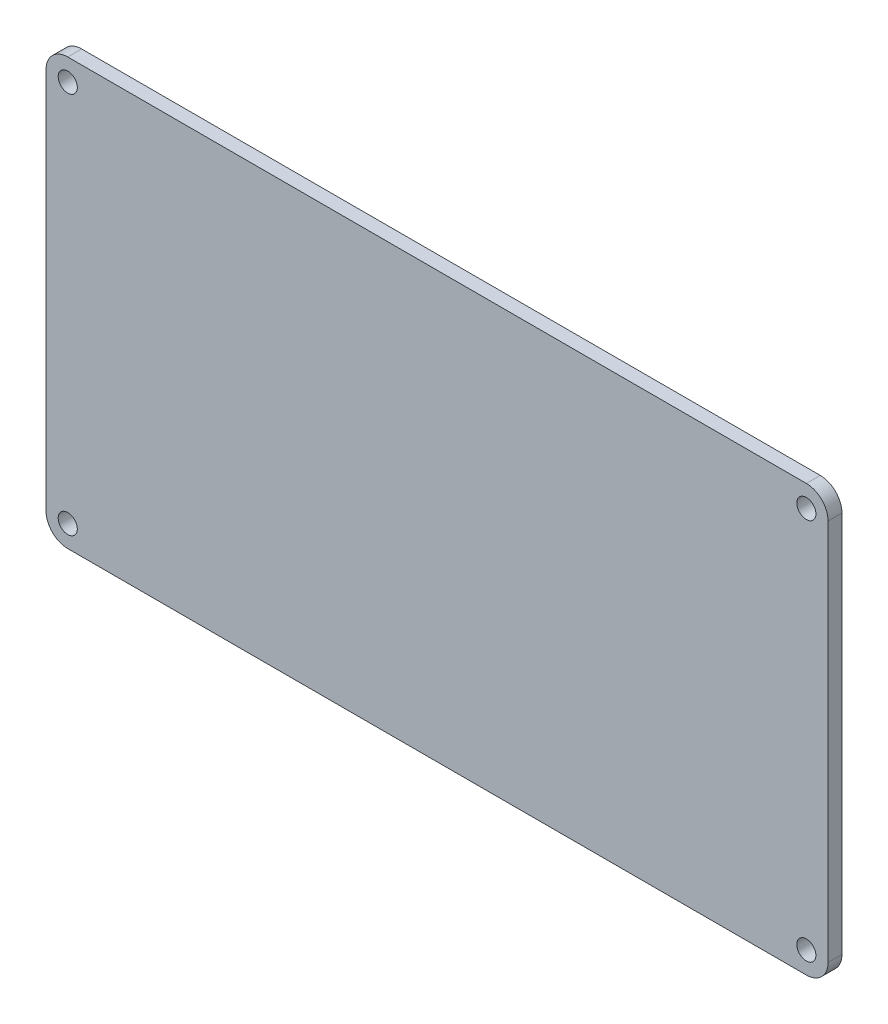
ISO-10303-21;
HEADER;
FILE_DESCRIPTION(('STEP AP214'),'2;1');
FILE_NAME('part.step','',(''),(''),'','','');
FILE_SCHEMA(('AUTOMOTIVE_DESIGN { 1 0 10303 214 1 1 1 1 }'));
ENDSEC;
DATA;
#1=APPLICATION_CONTEXT('core data for automotive mechanical design processes');
#2=APPLICATION_PROTOCOL_DEFINITION('international standard','automotive_design',2000,#1);
#3=PRODUCT_CONTEXT('',#1,'mechanical');
#4=PRODUCT('Part','Part','',(#3));
#5=PRODUCT_RELATED_PRODUCT_CATEGORY('part','',(#4));
#6=PRODUCT_DEFINITION_FORMATION('','',#4);
#7=PRODUCT_DEFINITION_CONTEXT('part definition',#1,'design');
#8=PRODUCT_DEFINITION('design','',#6,#7);
#9=PRODUCT_DEFINITION_SHAPE('','',#8);
#10=(LENGTH_UNIT() NAMED_UNIT(*) SI_UNIT(.MILLI.,.METRE.));
#11=(NAMED_UNIT(*) PLANE_ANGLE_UNIT() SI_UNIT($,.RADIAN.));
#12=(NAMED_UNIT(*) SI_UNIT($,.STERADIAN.) SOLID_ANGLE_UNIT());
#13=UNCERTAINTY_MEASURE_WITH_UNIT(LENGTH_MEASURE(1.E-05),#10,'distance_accuracy_value','');
#14=(GEOMETRIC_REPRESENTATION_CONTEXT(3) GLOBAL_UNCERTAINTY_ASSIGNED_CONTEXT((#13)) GLOBAL_UNIT_ASSIGNED_CONTEXT((#10,
#11,#12)) REPRESENTATION_CONTEXT('',''));
#15=CARTESIAN_POINT('',(0.,0.,0.));
#16=DIRECTION('',(0.,0.,1.));
#17=DIRECTION('',(1.,0.,0.));
#18=AXIS2_PLACEMENT_3D('',#15,#16,#17);
#19=CARTESIAN_POINT('',(45.,24.5,1.6));
#20=DIRECTION('',(-1.,0.,0.));
#21=DIRECTION('',(0.,-1.,0.));
#22=AXIS2_PLACEMENT_3D('',#19,#20,#21);
#23=PLANE('',#22);
#24=DIRECTION('',(0.,1.,0.));
#25=VECTOR('',#24,1.);
#26=CARTESIAN_POINT('',(45.,24.5,1.6));
#27=LINE('',#26,#25);
#28=CARTESIAN_POINT('',(45.,-22.,1.6));
#29=VERTEX_POINT('',#28);
#30=CARTESIAN_POINT('',(45.,22.,1.6));
#31=VERTEX_POINT('',#30);
#32=EDGE_CURVE('E132',#29,#31,#27,.T.);
#33=ORIENTED_EDGE('',*,*,#32,.F.);
#34=DIRECTION('',(0.,0.,-1.));
#35=VECTOR('',#34,1.);
#36=CARTESIAN_POINT('',(45.,-22.,1.6));
#37=LINE('',#36,#35);
#38=CARTESIAN_POINT('',(45.,-22.,0.));
#39=VERTEX_POINT('',#38);
#40=EDGE_CURVE('E11',#29,#39,#37,.T.);
#41=ORIENTED_EDGE('',*,*,#40,.T.);
#42=DIRECTION('',(0.,1.,0.));
#43=VECTOR('',#42,1.);
#44=CARTESIAN_POINT('',(45.,24.5,0.));
#45=LINE('',#44,#43);
#46=CARTESIAN_POINT('',(45.,22.,0.));
#47=VERTEX_POINT('',#46);
#48=EDGE_CURVE('E134',#39,#47,#45,.T.);
#49=ORIENTED_EDGE('',*,*,#48,.T.);
#50=DIRECTION('',(0.,0.,-1.));
#51=VECTOR('',#50,1.);
#52=CARTESIAN_POINT('',(45.,22.,1.6));
#53=LINE('',#52,#51);
#54=EDGE_CURVE('E45',#47,#31,#53,.F.);
#55=ORIENTED_EDGE('',*,*,#54,.T.);
#56=EDGE_LOOP('',(#33,#41,#49,#55));
#57=FACE_BOUND('',#56,.T.);
#58=ADVANCED_FACE('F37',(#57),#23,.F.);
#59=CARTESIAN_POINT('',(-45.,24.5,1.6));
#60=DIRECTION('',(0.,-1.,0.));
#61=DIRECTION('',(0.,0.,-1.));
#62=AXIS2_PLACEMENT_3D('',#59,#60,#61);
#63=PLANE('',#62);
#64=DIRECTION('',(-1.,0.,0.));
#65=VECTOR('',#64,1.);
#66=CARTESIAN_POINT('',(-45.,24.5,0.));
#67=LINE('',#66,#65);
#68=CARTESIAN_POINT('',(42.5,24.5,0.));
#69=VERTEX_POINT('',#68);
#70=CARTESIAN_POINT('',(-42.5,24.5,0.));
#71=VERTEX_POINT('',#70);
#72=EDGE_CURVE('E130',#69,#71,#67,.T.);
#73=ORIENTED_EDGE('',*,*,#72,.T.);
#74=DIRECTION('',(0.,0.,-1.));
#75=VECTOR('',#74,1.);
#76=CARTESIAN_POINT('',(-42.5,24.5,1.6));
#77=LINE('',#76,#75);
#78=CARTESIAN_POINT('',(-42.5,24.5,1.6));
#79=VERTEX_POINT('',#78);
#80=EDGE_CURVE('E109',#71,#79,#77,.F.);
#81=ORIENTED_EDGE('',*,*,#80,.T.);
#82=DIRECTION('',(-1.,0.,0.));
#83=VECTOR('',#82,1.);
#84=CARTESIAN_POINT('',(-45.,24.5,1.6));
#85=LINE('',#84,#83);
#86=CARTESIAN_POINT('',(42.5,24.5,1.6));
#87=VERTEX_POINT('',#86);
#88=EDGE_CURVE('E170',#87,#79,#85,.T.);
#89=ORIENTED_EDGE('',*,*,#88,.F.);
#90=DIRECTION('',(0.,0.,-1.));
#91=VECTOR('',#90,1.);
#92=CARTESIAN_POINT('',(42.5,24.5,1.6));
#93=LINE('',#92,#91);
#94=EDGE_CURVE('E114',#87,#69,#93,.T.);
#95=ORIENTED_EDGE('',*,*,#94,.T.);
#96=EDGE_LOOP('',(#73,#81,#89,#95));
#97=FACE_BOUND('',#96,.T.);
#98=ADVANCED_FACE('F174',(#97),#63,.F.);
#99=CARTESIAN_POINT('',(-45.,24.5,1.6));
#100=DIRECTION('',(1.,0.,0.));
#101=DIRECTION('',(0.,0.,-1.));
#102=AXIS2_PLACEMENT_3D('',#99,#100,#101);
#103=PLANE('',#102);
#104=DIRECTION('',(0.,-1.,0.));
#105=VECTOR('',#104,1.);
#106=CARTESIAN_POINT('',(-45.,24.5,1.6));
#107=LINE('',#106,#105);
#108=CARTESIAN_POINT('',(-45.,22.,1.6));
#109=VERTEX_POINT('',#108);
#110=CARTESIAN_POINT('',(-45.,-22.,1.6));
#111=VERTEX_POINT('',#110);
#112=EDGE_CURVE('E123',#109,#111,#107,.T.);
#113=ORIENTED_EDGE('',*,*,#112,.F.);
#114=DIRECTION('',(0.,0.,-1.));
#115=VECTOR('',#114,1.);
#116=CARTESIAN_POINT('',(-45.,22.,1.6));
#117=LINE('',#116,#115);
#118=CARTESIAN_POINT('',(-45.,22.,0.));
#119=VERTEX_POINT('',#118);
#120=EDGE_CURVE('E108',#109,#119,#117,.T.);
#121=ORIENTED_EDGE('',*,*,#120,.T.);
#122=DIRECTION('',(0.,-1.,0.));
#123=VECTOR('',#122,1.);
#124=CARTESIAN_POINT('',(-45.,24.5,0.));
#125=LINE('',#124,#123);
#126=CARTESIAN_POINT('',(-45.,-22.,0.));
#127=VERTEX_POINT('',#126);
#128=EDGE_CURVE('E121',#119,#127,#125,.T.);
#129=ORIENTED_EDGE('',*,*,#128,.T.);
#130=DIRECTION('',(0.,0.,-1.));
#131=VECTOR('',#130,1.);
#132=CARTESIAN_POINT('',(-45.,-22.,1.6));
#133=LINE('',#132,#131);
#134=EDGE_CURVE('E125',#127,#111,#133,.F.);
#135=ORIENTED_EDGE('',*,*,#134,.T.);
#136=EDGE_LOOP('',(#113,#121,#129,#135));
#137=FACE_BOUND('',#136,.T.);
#138=ADVANCED_FACE('F120',(#137),#103,.F.);
#139=CARTESIAN_POINT('',(-45.,-24.5,1.6));
#140=DIRECTION('',(0.,1.,0.));
#141=DIRECTION('',(0.,0.,1.));
#142=AXIS2_PLACEMENT_3D('',#139,#140,#141);
#143=PLANE('',#142);
#144=DIRECTION('',(1.,0.,0.));
#145=VECTOR('',#144,1.);
#146=CARTESIAN_POINT('',(-45.,-24.5,1.6));
#147=LINE('',#146,#145);
#148=CARTESIAN_POINT('',(-42.5,-24.5,1.6));
#149=VERTEX_POINT('',#148);
#150=CARTESIAN_POINT('',(42.5,-24.5,1.6));
#151=VERTEX_POINT('',#150);
#152=EDGE_CURVE('E138',#149,#151,#147,.T.);
#153=ORIENTED_EDGE('',*,*,#152,.F.);
#154=DIRECTION('',(0.,0.,-1.));
#155=VECTOR('',#154,1.);
#156=CARTESIAN_POINT('',(-42.5,-24.5,1.6));
#157=LINE('',#156,#155);
#158=CARTESIAN_POINT('',(-42.5,-24.5,0.));
#159=VERTEX_POINT('',#158);
#160=EDGE_CURVE('E155',#149,#159,#157,.T.);
#161=ORIENTED_EDGE('',*,*,#160,.T.);
#162=DIRECTION('',(1.,0.,0.));
#163=VECTOR('',#162,1.);
#164=CARTESIAN_POINT('',(-45.,-24.5,0.));
#165=LINE('',#164,#163);
#166=CARTESIAN_POINT('',(42.5,-24.5,0.));
#167=VERTEX_POINT('',#166);
#168=EDGE_CURVE('E129',#159,#167,#165,.T.);
#169=ORIENTED_EDGE('',*,*,#168,.T.);
#170=DIRECTION('',(0.,0.,-1.));
#171=VECTOR('',#170,1.);
#172=CARTESIAN_POINT('',(42.5,-24.5,1.6));
#173=LINE('',#172,#171);
#174=EDGE_CURVE('E52',#167,#151,#173,.F.);
#175=ORIENTED_EDGE('',*,*,#174,.T.);
#176=EDGE_LOOP('',(#153,#161,#169,#175));
#177=FACE_BOUND('',#176,.T.);
#178=ADVANCED_FACE('F259',(#177),#143,.F.);
#179=CARTESIAN_POINT('',(0.,0.,1.6));
#180=DIRECTION('',(0.,0.,1.));
#181=DIRECTION('',(1.,0.,0.));
#182=AXIS2_PLACEMENT_3D('',#179,#180,#181);
#183=PLANE('',#182);
#184=CARTESIAN_POINT('',(-42.5,-22.,1.6));
#185=DIRECTION('',(0.,0.,1.));
#186=DIRECTION('',(1.,0.,0.));
#187=AXIS2_PLACEMENT_3D('',#184,#185,#186);
#188=CIRCLE('',#187,1.10000000000001);
#189=CARTESIAN_POINT('',(-41.4,-22.,1.6));
#190=VERTEX_POINT('',#189);
#191=EDGE_CURVE('E175',#190,#190,#188,.T.);
#192=ORIENTED_EDGE('',*,*,#191,.F.);
#193=EDGE_LOOP('',(#192));
#194=FACE_BOUND('',#193,.T.);
#195=CARTESIAN_POINT('',(-42.5,22.,1.6));
#196=DIRECTION('',(0.,0.,1.));
#197=DIRECTION('',(1.,0.,0.));
#198=AXIS2_PLACEMENT_3D('',#195,#196,#197);
#199=CIRCLE('',#198,1.1);
#200=CARTESIAN_POINT('',(-41.4,22.,1.6));
#201=VERTEX_POINT('',#200);
#202=EDGE_CURVE('E177',#201,#201,#199,.T.);
#203=ORIENTED_EDGE('',*,*,#202,.F.);
#204=EDGE_LOOP('',(#203));
#205=FACE_BOUND('',#204,.T.);
#206=CARTESIAN_POINT('',(42.5,22.,1.6));
#207=DIRECTION('',(0.,0.,1.));
#208=DIRECTION('',(1.,0.,0.));
#209=AXIS2_PLACEMENT_3D('',#206,#207,#208);
#210=CIRCLE('',#209,1.1);
#211=CARTESIAN_POINT('',(43.6,22.,1.6));
#212=VERTEX_POINT('',#211);
#213=EDGE_CURVE('E185',#212,#212,#210,.T.);
#214=ORIENTED_EDGE('',*,*,#213,.F.);
#215=EDGE_LOOP('',(#214));
#216=FACE_BOUND('',#215,.T.);
#217=CARTESIAN_POINT('',(42.5,-22.,1.6));
#218=DIRECTION('',(0.,0.,1.));
#219=DIRECTION('',(1.,0.,0.));
#220=AXIS2_PLACEMENT_3D('',#217,#218,#219);
#221=CIRCLE('',#220,1.1);
#222=CARTESIAN_POINT('',(43.6,-22.,1.6));
#223=VERTEX_POINT('',#222);
#224=EDGE_CURVE('E188',#223,#223,#221,.T.);
#225=ORIENTED_EDGE('',*,*,#224,.F.);
#226=EDGE_LOOP('',(#225));
#227=FACE_BOUND('',#226,.T.);
#228=ORIENTED_EDGE('',*,*,#88,.T.);
#229=CARTESIAN_POINT('',(-42.5,22.,1.6));
#230=DIRECTION('',(0.,0.,1.));
#231=DIRECTION('',(1.,0.,0.));
#232=AXIS2_PLACEMENT_3D('',#229,#230,#231);
#233=CIRCLE('',#232,2.5);
#234=EDGE_CURVE('E152',#79,#109,#233,.T.);
#235=ORIENTED_EDGE('',*,*,#234,.T.);
#236=ORIENTED_EDGE('',*,*,#112,.T.);
#237=CARTESIAN_POINT('',(-42.5,-22.,1.6));
#238=DIRECTION('',(0.,0.,1.));
#239=DIRECTION('',(1.,0.,0.));
#240=AXIS2_PLACEMENT_3D('',#237,#238,#239);
#241=CIRCLE('',#240,2.5);
#242=EDGE_CURVE('E59',#111,#149,#241,.T.);
#243=ORIENTED_EDGE('',*,*,#242,.T.);
#244=ORIENTED_EDGE('',*,*,#152,.T.);
#245=CARTESIAN_POINT('',(42.5,-22.,1.6));
#246=DIRECTION('',(0.,0.,1.));
#247=DIRECTION('',(1.,0.,0.));
#248=AXIS2_PLACEMENT_3D('',#245,#246,#247);
#249=CIRCLE('',#248,2.5);
#250=EDGE_CURVE('E149',#151,#29,#249,.T.);
#251=ORIENTED_EDGE('',*,*,#250,.T.);
#252=ORIENTED_EDGE('',*,*,#32,.T.);
#253=CARTESIAN_POINT('',(42.5,22.,1.6));
#254=DIRECTION('',(0.,0.,1.));
#255=DIRECTION('',(1.,0.,0.));
#256=AXIS2_PLACEMENT_3D('',#253,#254,#255);
#257=CIRCLE('',#256,2.5);
#258=EDGE_CURVE('E147',#31,#87,#257,.T.);
#259=ORIENTED_EDGE('',*,*,#258,.T.);
#260=EDGE_LOOP('',(#228,#235,#236,#243,#244,#251,#252,#259));
#261=FACE_BOUND('',#260,.T.);
#262=ADVANCED_FACE('F167',(#194,#205,#216,#227,#261),#183,.T.);
#263=CARTESIAN_POINT('',(0.,0.,0.));
#264=DIRECTION('',(0.,0.,1.));
#265=DIRECTION('',(1.,0.,0.));
#266=AXIS2_PLACEMENT_3D('',#263,#264,#265);
#267=PLANE('',#266);
#268=CARTESIAN_POINT('',(-42.5,-22.,0.));
#269=DIRECTION('',(0.,0.,-1.));
#270=DIRECTION('',(-1.,0.,0.));
#271=AXIS2_PLACEMENT_3D('',#268,#269,#270);
#272=CIRCLE('',#271,1.10000000000001);
#273=CARTESIAN_POINT('',(-43.6,-22.,0.));
#274=VERTEX_POINT('',#273);
#275=EDGE_CURVE('E195',#274,#274,#272,.T.);
#276=ORIENTED_EDGE('',*,*,#275,.F.);
#277=EDGE_LOOP('',(#276));
#278=FACE_BOUND('',#277,.T.);
#279=CARTESIAN_POINT('',(-42.5,22.,0.));
#280=DIRECTION('',(0.,0.,-1.));
#281=DIRECTION('',(-1.,0.,0.));
#282=AXIS2_PLACEMENT_3D('',#279,#280,#281);
#283=CIRCLE('',#282,1.1);
#284=CARTESIAN_POINT('',(-43.6,22.,0.));
#285=VERTEX_POINT('',#284);
#286=EDGE_CURVE('E198',#285,#285,#283,.T.);
#287=ORIENTED_EDGE('',*,*,#286,.F.);
#288=EDGE_LOOP('',(#287));
#289=FACE_BOUND('',#288,.T.);
#290=CARTESIAN_POINT('',(42.5,22.,0.));
#291=DIRECTION('',(0.,0.,-1.));
#292=DIRECTION('',(-1.,0.,0.));
#293=AXIS2_PLACEMENT_3D('',#290,#291,#292);
#294=CIRCLE('',#293,1.1);
#295=CARTESIAN_POINT('',(41.4,22.,0.));
#296=VERTEX_POINT('',#295);
#297=EDGE_CURVE('E194',#296,#296,#294,.T.);
#298=ORIENTED_EDGE('',*,*,#297,.F.);
#299=EDGE_LOOP('',(#298));
#300=FACE_BOUND('',#299,.T.);
#301=CARTESIAN_POINT('',(42.5,-22.,0.));
#302=DIRECTION('',(0.,0.,-1.));
#303=DIRECTION('',(-1.,0.,0.));
#304=AXIS2_PLACEMENT_3D('',#301,#302,#303);
#305=CIRCLE('',#304,1.1);
#306=CARTESIAN_POINT('',(41.4,-22.,0.));
#307=VERTEX_POINT('',#306);
#308=EDGE_CURVE('E191',#307,#307,#305,.T.);
#309=ORIENTED_EDGE('',*,*,#308,.F.);
#310=EDGE_LOOP('',(#309));
#311=FACE_BOUND('',#310,.T.);
#312=ORIENTED_EDGE('',*,*,#128,.F.);
#313=CARTESIAN_POINT('',(-42.5,22.,0.));
#314=DIRECTION('',(0.,0.,1.));
#315=DIRECTION('',(1.,0.,0.));
#316=AXIS2_PLACEMENT_3D('',#313,#314,#315);
#317=CIRCLE('',#316,2.5);
#318=EDGE_CURVE('E104',#119,#71,#317,.F.);
#319=ORIENTED_EDGE('',*,*,#318,.T.);
#320=ORIENTED_EDGE('',*,*,#72,.F.);
#321=CARTESIAN_POINT('',(42.5,22.,0.));
#322=DIRECTION('',(0.,0.,1.));
#323=DIRECTION('',(1.,0.,0.));
#324=AXIS2_PLACEMENT_3D('',#321,#322,#323);
#325=CIRCLE('',#324,2.5);
#326=EDGE_CURVE('E124',#69,#47,#325,.F.);
#327=ORIENTED_EDGE('',*,*,#326,.T.);
#328=ORIENTED_EDGE('',*,*,#48,.F.);
#329=CARTESIAN_POINT('',(42.5,-22.,0.));
#330=DIRECTION('',(0.,0.,1.));
#331=DIRECTION('',(1.,0.,0.));
#332=AXIS2_PLACEMENT_3D('',#329,#330,#331);
#333=CIRCLE('',#332,2.5);
#334=EDGE_CURVE('E141',#39,#167,#333,.F.);
#335=ORIENTED_EDGE('',*,*,#334,.T.);
#336=ORIENTED_EDGE('',*,*,#168,.F.);
#337=CARTESIAN_POINT('',(-42.5,-22.,0.));
#338=DIRECTION('',(0.,0.,1.));
#339=DIRECTION('',(1.,0.,0.));
#340=AXIS2_PLACEMENT_3D('',#337,#338,#339);
#341=CIRCLE('',#340,2.5);
#342=EDGE_CURVE('E115',#159,#127,#341,.F.);
#343=ORIENTED_EDGE('',*,*,#342,.T.);
#344=EDGE_LOOP('',(#312,#319,#320,#327,#328,#335,#336,#343));
#345=FACE_BOUND('',#344,.T.);
#346=ADVANCED_FACE('F127',(#278,#289,#300,#311,#345),#267,.F.);
#347=CARTESIAN_POINT('',(-42.5,22.,1.6));
#348=DIRECTION('',(0.,0.,-1.));
#349=DIRECTION('',(-1.,0.,0.));
#350=AXIS2_PLACEMENT_3D('',#347,#348,#349);
#351=CYLINDRICAL_SURFACE('',#350,2.5);
#352=ORIENTED_EDGE('',*,*,#234,.F.);
#353=ORIENTED_EDGE('',*,*,#80,.F.);
#354=ORIENTED_EDGE('',*,*,#318,.F.);
#355=ORIENTED_EDGE('',*,*,#120,.F.);
#356=EDGE_LOOP('',(#352,#353,#354,#355));
#357=FACE_BOUND('',#356,.T.);
#358=ADVANCED_FACE('F107',(#357),#351,.T.);
#359=CARTESIAN_POINT('',(-42.5,-22.,1.6));
#360=DIRECTION('',(0.,0.,-1.));
#361=DIRECTION('',(-1.,0.,0.));
#362=AXIS2_PLACEMENT_3D('',#359,#360,#361);
#363=CYLINDRICAL_SURFACE('',#362,2.5);
#364=ORIENTED_EDGE('',*,*,#242,.F.);
#365=ORIENTED_EDGE('',*,*,#134,.F.);
#366=ORIENTED_EDGE('',*,*,#342,.F.);
#367=ORIENTED_EDGE('',*,*,#160,.F.);
#368=EDGE_LOOP('',(#364,#365,#366,#367));
#369=FACE_BOUND('',#368,.T.);
#370=ADVANCED_FACE('F236',(#369),#363,.T.);
#371=CARTESIAN_POINT('',(42.5,-22.,1.6));
#372=DIRECTION('',(0.,0.,-1.));
#373=DIRECTION('',(-1.,0.,0.));
#374=AXIS2_PLACEMENT_3D('',#371,#372,#373);
#375=CYLINDRICAL_SURFACE('',#374,2.5);
#376=ORIENTED_EDGE('',*,*,#250,.F.);
#377=ORIENTED_EDGE('',*,*,#174,.F.);
#378=ORIENTED_EDGE('',*,*,#334,.F.);
#379=ORIENTED_EDGE('',*,*,#40,.F.);
#380=EDGE_LOOP('',(#376,#377,#378,#379));
#381=FACE_BOUND('',#380,.T.);
#382=ADVANCED_FACE('F223',(#381),#375,.T.);
#383=CARTESIAN_POINT('',(42.5,22.,1.6));
#384=DIRECTION('',(0.,0.,-1.));
#385=DIRECTION('',(-1.,0.,0.));
#386=AXIS2_PLACEMENT_3D('',#383,#384,#385);
#387=CYLINDRICAL_SURFACE('',#386,2.5);
#388=ORIENTED_EDGE('',*,*,#258,.F.);
#389=ORIENTED_EDGE('',*,*,#54,.F.);
#390=ORIENTED_EDGE('',*,*,#326,.F.);
#391=ORIENTED_EDGE('',*,*,#94,.F.);
#392=EDGE_LOOP('',(#388,#389,#390,#391));
#393=FACE_BOUND('',#392,.T.);
#394=ADVANCED_FACE('F39',(#393),#387,.T.);
#395=CARTESIAN_POINT('',(42.5,-22.,26.6));
#396=DIRECTION('',(0.,0.,-1.));
#397=DIRECTION('',(-1.,0.,0.));
#398=AXIS2_PLACEMENT_3D('',#395,#396,#397);
#399=CYLINDRICAL_SURFACE('',#398,1.1);
#400=ORIENTED_EDGE('',*,*,#224,.T.);
#401=EDGE_LOOP('',(#400));
#402=FACE_BOUND('',#401,.T.);
#403=ORIENTED_EDGE('',*,*,#308,.T.);
#404=EDGE_LOOP('',(#403));
#405=FACE_BOUND('',#404,.T.);
#406=ADVANCED_FACE('F212',(#402,#405),#399,.F.);
#407=CARTESIAN_POINT('',(42.5,22.,26.6));
#408=DIRECTION('',(0.,0.,-1.));
#409=DIRECTION('',(-1.,0.,0.));
#410=AXIS2_PLACEMENT_3D('',#407,#408,#409);
#411=CYLINDRICAL_SURFACE('',#410,1.1);
#412=ORIENTED_EDGE('',*,*,#213,.T.);
#413=EDGE_LOOP('',(#412));
#414=FACE_BOUND('',#413,.T.);
#415=ORIENTED_EDGE('',*,*,#297,.T.);
#416=EDGE_LOOP('',(#415));
#417=FACE_BOUND('',#416,.T.);
#418=ADVANCED_FACE('F204',(#414,#417),#411,.F.);
#419=CARTESIAN_POINT('',(-42.5,22.,26.6));
#420=DIRECTION('',(0.,0.,-1.));
#421=DIRECTION('',(-1.,0.,0.));
#422=AXIS2_PLACEMENT_3D('',#419,#420,#421);
#423=CYLINDRICAL_SURFACE('',#422,1.1);
#424=ORIENTED_EDGE('',*,*,#202,.T.);
#425=EDGE_LOOP('',(#424));
#426=FACE_BOUND('',#425,.T.);
#427=ORIENTED_EDGE('',*,*,#286,.T.);
#428=EDGE_LOOP('',(#427));
#429=FACE_BOUND('',#428,.T.);
#430=ADVANCED_FACE('F220',(#426,#429),#423,.F.);
#431=CARTESIAN_POINT('',(-42.5,-22.,26.6));
#432=DIRECTION('',(0.,0.,-1.));
#433=DIRECTION('',(-1.,0.,0.));
#434=AXIS2_PLACEMENT_3D('',#431,#432,#433);
#435=CYLINDRICAL_SURFACE('',#434,1.10000000000001);
#436=ORIENTED_EDGE('',*,*,#191,.T.);
#437=EDGE_LOOP('',(#436));
#438=FACE_BOUND('',#437,.T.);
#439=ORIENTED_EDGE('',*,*,#275,.T.);
#440=EDGE_LOOP('',(#439));
#441=FACE_BOUND('',#440,.T.);
#442=ADVANCED_FACE('F286',(#438,#441),#435,.F.);
#443=CLOSED_SHELL('',(#58,#98,#138,#178,#262,#346,#358,#370,#382,#394,#406,#418,#430,#442));
#444=MANIFOLD_SOLID_BREP('B2',#443);
#445=ADVANCED_BREP_SHAPE_REPRESENTATION('',(#18,#444),#14);
#446=SHAPE_DEFINITION_REPRESENTATION(#9,#445);
ENDSEC;
END-ISO-10303-21;
